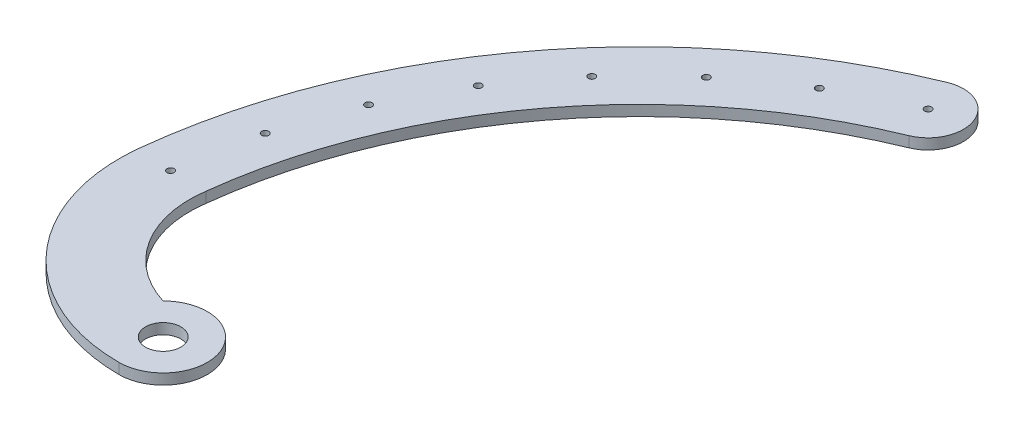
ISO-10303-21;
HEADER;
FILE_DESCRIPTION(('STEP AP214'),'2;1');
FILE_NAME('part.step','',(''),(''),'','','');
FILE_SCHEMA(('AUTOMOTIVE_DESIGN { 1 0 10303 214 1 1 1 1 }'));
ENDSEC;
DATA;
#1=APPLICATION_CONTEXT('core data for automotive mechanical design processes');
#2=APPLICATION_PROTOCOL_DEFINITION('international standard','automotive_design',2000,#1);
#3=PRODUCT_CONTEXT('',#1,'mechanical');
#4=PRODUCT('Part','Part','',(#3));
#5=PRODUCT_RELATED_PRODUCT_CATEGORY('part','',(#4));
#6=PRODUCT_DEFINITION_FORMATION('','',#4);
#7=PRODUCT_DEFINITION_CONTEXT('part definition',#1,'design');
#8=PRODUCT_DEFINITION('design','',#6,#7);
#9=PRODUCT_DEFINITION_SHAPE('','',#8);
#10=(LENGTH_UNIT() NAMED_UNIT(*) SI_UNIT(.MILLI.,.METRE.));
#11=(NAMED_UNIT(*) PLANE_ANGLE_UNIT() SI_UNIT($,.RADIAN.));
#12=(NAMED_UNIT(*) SI_UNIT($,.STERADIAN.) SOLID_ANGLE_UNIT());
#13=UNCERTAINTY_MEASURE_WITH_UNIT(LENGTH_MEASURE(1.E-05),#10,'distance_accuracy_value','');
#14=(GEOMETRIC_REPRESENTATION_CONTEXT(3) GLOBAL_UNCERTAINTY_ASSIGNED_CONTEXT((#13)) GLOBAL_UNIT_ASSIGNED_CONTEXT((#10,
#11,#12)) REPRESENTATION_CONTEXT('',''));
#15=CARTESIAN_POINT('',(0.,0.,0.));
#16=DIRECTION('',(0.,0.,1.));
#17=DIRECTION('',(1.,0.,0.));
#18=AXIS2_PLACEMENT_3D('',#15,#16,#17);
#19=CARTESIAN_POINT('',(0.,3.,-37.5));
#20=DIRECTION('',(0.,-1.,0.));
#21=DIRECTION('',(0.,0.,-1.));
#22=AXIS2_PLACEMENT_3D('',#19,#20,#21);
#23=CYLINDRICAL_SURFACE('',#22,30.0157409010684);
#24=CARTESIAN_POINT('',(0.,0.,-37.5));
#25=DIRECTION('',(0.,1.,0.));
#26=DIRECTION('',(0.,0.,1.));
#27=AXIS2_PLACEMENT_3D('',#24,#25,#26);
#28=CIRCLE('',#27,30.0157409010684);
#29=CARTESIAN_POINT('',(-29.697678368394,0.,-41.8580501795522));
#30=VERTEX_POINT('',#29);
#31=CARTESIAN_POINT('',(-8.85689524207893,0.,-8.82073730879906));
#32=VERTEX_POINT('',#31);
#33=EDGE_CURVE('E137',#30,#32,#28,.T.);
#34=ORIENTED_EDGE('',*,*,#33,.F.);
#35=DIRECTION('',(0.,-1.,0.));
#36=VECTOR('',#35,1.);
#37=CARTESIAN_POINT('',(-29.697678368394,3.,-41.8580501795522));
#38=LINE('',#37,#36);
#39=CARTESIAN_POINT('',(-29.697678368394,3.,-41.8580501795522));
#40=VERTEX_POINT('',#39);
#41=EDGE_CURVE('E11',#40,#30,#38,.T.);
#42=ORIENTED_EDGE('',*,*,#41,.F.);
#43=CARTESIAN_POINT('',(0.,3.,-37.5));
#44=DIRECTION('',(0.,1.,0.));
#45=DIRECTION('',(0.,0.,1.));
#46=AXIS2_PLACEMENT_3D('',#43,#44,#45);
#47=CIRCLE('',#46,30.0157409010684);
#48=CARTESIAN_POINT('',(-8.85689524207893,3.,-8.82073730879906));
#49=VERTEX_POINT('',#48);
#50=EDGE_CURVE('E254',#40,#49,#47,.T.);
#51=ORIENTED_EDGE('',*,*,#50,.T.);
#52=DIRECTION('',(0.,-1.,0.));
#53=VECTOR('',#52,1.);
#54=CARTESIAN_POINT('',(-8.85689524207893,3.,-8.82073730879906));
#55=LINE('',#54,#53);
#56=EDGE_CURVE('E86',#49,#32,#55,.T.);
#57=ORIENTED_EDGE('',*,*,#56,.T.);
#58=EDGE_LOOP('',(#34,#42,#51,#57));
#59=FACE_BOUND('',#58,.T.);
#60=ADVANCED_FACE('F41',(#59),#23,.F.);
#61=CARTESIAN_POINT('',(109.34518028774,3.,-25.5153620062314));
#62=DIRECTION('',(0.,-1.,0.));
#63=DIRECTION('',(0.,0.,-1.));
#64=AXIS2_PLACEMENT_3D('',#61,#62,#63);
#65=CYLINDRICAL_SURFACE('',#64,140.);
#66=CARTESIAN_POINT('',(109.34518028774,0.,-25.5153620062314));
#67=DIRECTION('',(0.,1.,0.));
#68=DIRECTION('',(0.,0.,1.));
#69=AXIS2_PLACEMENT_3D('',#66,#67,#68);
#70=CIRCLE('',#69,140.);
#71=CARTESIAN_POINT('',(56.238508843267,0.,-155.051771745304));
#72=VERTEX_POINT('',#71);
#73=EDGE_CURVE('E135',#30,#72,#70,.F.);
#74=ORIENTED_EDGE('',*,*,#73,.T.);
#75=DIRECTION('',(0.,-1.,0.));
#76=VECTOR('',#75,1.);
#77=CARTESIAN_POINT('',(56.238508843267,3.,-155.051771745304));
#78=LINE('',#77,#76);
#79=CARTESIAN_POINT('',(56.238508843267,3.,-155.051771745304));
#80=VERTEX_POINT('',#79);
#81=EDGE_CURVE('E50',#80,#72,#78,.T.);
#82=ORIENTED_EDGE('',*,*,#81,.F.);
#83=CARTESIAN_POINT('',(109.34518028774,3.,-25.5153620062314));
#84=DIRECTION('',(0.,1.,0.));
#85=DIRECTION('',(0.,0.,1.));
#86=AXIS2_PLACEMENT_3D('',#83,#84,#85);
#87=CIRCLE('',#86,140.);
#88=EDGE_CURVE('E256',#40,#80,#87,.F.);
#89=ORIENTED_EDGE('',*,*,#88,.F.);
#90=ORIENTED_EDGE('',*,*,#41,.T.);
#91=EDGE_LOOP('',(#74,#82,#89,#90));
#92=FACE_BOUND('',#91,.T.);
#93=ADVANCED_FACE('F136',(#92),#65,.F.);
#94=CARTESIAN_POINT('',(52.4451751686618,3.,-164.304372440952));
#95=DIRECTION('',(0.,-1.,0.));
#96=DIRECTION('',(0.,0.,-1.));
#97=AXIS2_PLACEMENT_3D('',#94,#95,#96);
#98=CYLINDRICAL_SURFACE('',#97,10.);
#99=CARTESIAN_POINT('',(52.4451751686618,0.,-164.304372440952));
#100=DIRECTION('',(0.,1.,0.));
#101=DIRECTION('',(0.,0.,1.));
#102=AXIS2_PLACEMENT_3D('',#99,#100,#101);
#103=CIRCLE('',#102,10.);
#104=CARTESIAN_POINT('',(48.6518414940566,0.,-173.5569731366));
#105=VERTEX_POINT('',#104);
#106=EDGE_CURVE('E132',#72,#105,#103,.T.);
#107=ORIENTED_EDGE('',*,*,#106,.T.);
#108=DIRECTION('',(0.,-1.,0.));
#109=VECTOR('',#108,1.);
#110=CARTESIAN_POINT('',(48.6518414940566,3.,-173.5569731366));
#111=LINE('',#110,#109);
#112=CARTESIAN_POINT('',(48.6518414940566,3.,-173.5569731366));
#113=VERTEX_POINT('',#112);
#114=EDGE_CURVE('E121',#113,#105,#111,.T.);
#115=ORIENTED_EDGE('',*,*,#114,.F.);
#116=CARTESIAN_POINT('',(52.4451751686618,3.,-164.304372440952));
#117=DIRECTION('',(0.,1.,0.));
#118=DIRECTION('',(0.,0.,1.));
#119=AXIS2_PLACEMENT_3D('',#116,#117,#118);
#120=CIRCLE('',#119,10.);
#121=EDGE_CURVE('E114',#80,#113,#120,.T.);
#122=ORIENTED_EDGE('',*,*,#121,.F.);
#123=ORIENTED_EDGE('',*,*,#81,.T.);
#124=EDGE_LOOP('',(#107,#115,#122,#123));
#125=FACE_BOUND('',#124,.T.);
#126=ADVANCED_FACE('F131',(#125),#98,.T.);
#127=CARTESIAN_POINT('',(109.34518028774,3.,-25.5153620062314));
#128=DIRECTION('',(0.,-1.,0.));
#129=DIRECTION('',(0.,0.,-1.));
#130=AXIS2_PLACEMENT_3D('',#127,#128,#129);
#131=CYLINDRICAL_SURFACE('',#130,160.);
#132=CARTESIAN_POINT('',(109.34518028774,0.,-25.5153620062314));
#133=DIRECTION('',(0.,1.,0.));
#134=DIRECTION('',(0.,0.,1.));
#135=AXIS2_PLACEMENT_3D('',#132,#133,#134);
#136=CIRCLE('',#135,160.);
#137=CARTESIAN_POINT('',(-49.7023546762454,0.,-42.9475627244403));
#138=VERTEX_POINT('',#137);
#139=EDGE_CURVE('E120',#105,#138,#136,.T.);
#140=ORIENTED_EDGE('',*,*,#139,.T.);
#141=DIRECTION('',(0.,-1.,0.));
#142=VECTOR('',#141,1.);
#143=CARTESIAN_POINT('',(-49.7023546762454,3.,-42.9475627244403));
#144=LINE('',#143,#142);
#145=CARTESIAN_POINT('',(-49.7023546762454,3.,-42.9475627244403));
#146=VERTEX_POINT('',#145);
#147=EDGE_CURVE('E105',#146,#138,#144,.T.);
#148=ORIENTED_EDGE('',*,*,#147,.F.);
#149=CARTESIAN_POINT('',(109.34518028774,3.,-25.5153620062314));
#150=DIRECTION('',(0.,1.,0.));
#151=DIRECTION('',(0.,0.,1.));
#152=AXIS2_PLACEMENT_3D('',#149,#150,#151);
#153=CIRCLE('',#152,160.);
#154=EDGE_CURVE('E108',#113,#146,#153,.T.);
#155=ORIENTED_EDGE('',*,*,#154,.F.);
#156=ORIENTED_EDGE('',*,*,#114,.T.);
#157=EDGE_LOOP('',(#140,#148,#155,#156));
#158=FACE_BOUND('',#157,.T.);
#159=ADVANCED_FACE('F119',(#158),#131,.T.);
#160=CARTESIAN_POINT('',(0.,3.,-37.5));
#161=DIRECTION('',(0.,-1.,0.));
#162=DIRECTION('',(0.,0.,-1.));
#163=AXIS2_PLACEMENT_3D('',#160,#161,#162);
#164=CYLINDRICAL_SURFACE('',#163,50.);
#165=CARTESIAN_POINT('',(0.,0.,-37.5));
#166=DIRECTION('',(0.,1.,0.));
#167=DIRECTION('',(0.,0.,1.));
#168=AXIS2_PLACEMENT_3D('',#165,#166,#167);
#169=CIRCLE('',#168,50.);
#170=CARTESIAN_POINT('',(0.,0.,12.5));
#171=VERTEX_POINT('',#170);
#172=EDGE_CURVE('E145',#138,#171,#169,.T.);
#173=ORIENTED_EDGE('',*,*,#172,.T.);
#174=DIRECTION('',(0.,-1.,0.));
#175=VECTOR('',#174,1.);
#176=CARTESIAN_POINT('',(0.,3.,12.5));
#177=LINE('',#176,#175);
#178=CARTESIAN_POINT('',(0.,3.,12.5));
#179=VERTEX_POINT('',#178);
#180=EDGE_CURVE('E107',#179,#171,#177,.T.);
#181=ORIENTED_EDGE('',*,*,#180,.F.);
#182=CARTESIAN_POINT('',(0.,3.,-37.5));
#183=DIRECTION('',(0.,1.,0.));
#184=DIRECTION('',(0.,0.,1.));
#185=AXIS2_PLACEMENT_3D('',#182,#183,#184);
#186=CIRCLE('',#185,50.);
#187=EDGE_CURVE('E100',#146,#179,#186,.T.);
#188=ORIENTED_EDGE('',*,*,#187,.F.);
#189=ORIENTED_EDGE('',*,*,#147,.T.);
#190=EDGE_LOOP('',(#173,#181,#188,#189));
#191=FACE_BOUND('',#190,.T.);
#192=ADVANCED_FACE('F103',(#191),#164,.T.);
#193=CARTESIAN_POINT('',(0.,3.,0.));
#194=DIRECTION('',(0.,-1.,0.));
#195=DIRECTION('',(0.,0.,-1.));
#196=AXIS2_PLACEMENT_3D('',#193,#194,#195);
#197=CYLINDRICAL_SURFACE('',#196,5.);
#198=CARTESIAN_POINT('',(0.,3.,0.));
#199=DIRECTION('',(0.,1.,0.));
#200=DIRECTION('',(0.,0.,1.));
#201=AXIS2_PLACEMENT_3D('',#198,#199,#200);
#202=CIRCLE('',#201,5.);
#203=CARTESIAN_POINT('',(0.,3.,5.));
#204=VERTEX_POINT('',#203);
#205=EDGE_CURVE('E156',#204,#204,#202,.T.);
#206=ORIENTED_EDGE('',*,*,#205,.T.);
#207=EDGE_LOOP('',(#206));
#208=FACE_BOUND('',#207,.T.);
#209=CARTESIAN_POINT('',(0.,0.,0.));
#210=DIRECTION('',(0.,1.,0.));
#211=DIRECTION('',(0.,0.,1.));
#212=AXIS2_PLACEMENT_3D('',#209,#210,#211);
#213=CIRCLE('',#212,5.);
#214=CARTESIAN_POINT('',(0.,0.,5.));
#215=VERTEX_POINT('',#214);
#216=EDGE_CURVE('E148',#215,#215,#213,.T.);
#217=ORIENTED_EDGE('',*,*,#216,.F.);
#218=EDGE_LOOP('',(#217));
#219=FACE_BOUND('',#218,.T.);
#220=ADVANCED_FACE('F199',(#208,#219),#197,.F.);
#221=CARTESIAN_POINT('',(0.,3.,0.));
#222=DIRECTION('',(0.,-1.,0.));
#223=DIRECTION('',(0.,0.,-1.));
#224=AXIS2_PLACEMENT_3D('',#221,#222,#223);
#225=CYLINDRICAL_SURFACE('',#224,12.5);
#226=CARTESIAN_POINT('',(0.,0.,0.));
#227=DIRECTION('',(0.,1.,0.));
#228=DIRECTION('',(0.,0.,1.));
#229=AXIS2_PLACEMENT_3D('',#226,#227,#228);
#230=CIRCLE('',#229,12.5);
#231=EDGE_CURVE('E79',#171,#32,#230,.T.);
#232=ORIENTED_EDGE('',*,*,#231,.T.);
#233=ORIENTED_EDGE('',*,*,#56,.F.);
#234=CARTESIAN_POINT('',(0.,3.,0.));
#235=DIRECTION('',(0.,1.,0.));
#236=DIRECTION('',(0.,0.,1.));
#237=AXIS2_PLACEMENT_3D('',#234,#235,#236);
#238=CIRCLE('',#237,12.5);
#239=EDGE_CURVE('E58',#179,#49,#238,.T.);
#240=ORIENTED_EDGE('',*,*,#239,.F.);
#241=ORIENTED_EDGE('',*,*,#180,.T.);
#242=EDGE_LOOP('',(#232,#233,#240,#241));
#243=FACE_BOUND('',#242,.T.);
#244=ADVANCED_FACE('F189',(#243),#225,.T.);
#245=CARTESIAN_POINT('',(31.9293953515161,3.,-153.994139408215));
#246=DIRECTION('',(0.,-1.,0.));
#247=DIRECTION('',(0.,0.,-1.));
#248=AXIS2_PLACEMENT_3D('',#245,#246,#247);
#249=CYLINDRICAL_SURFACE('',#248,0.999999999999992);
#250=CARTESIAN_POINT('',(31.9293953515161,3.,-153.994139408215));
#251=DIRECTION('',(0.,1.,0.));
#252=DIRECTION('',(0.,0.,1.));
#253=AXIS2_PLACEMENT_3D('',#250,#251,#252);
#254=CIRCLE('',#253,0.999999999999992);
#255=CARTESIAN_POINT('',(31.9293953515161,3.,-152.994139408215));
#256=VERTEX_POINT('',#255);
#257=EDGE_CURVE('E253',#256,#256,#254,.T.);
#258=ORIENTED_EDGE('',*,*,#257,.T.);
#259=EDGE_LOOP('',(#258));
#260=FACE_BOUND('',#259,.T.);
#261=CARTESIAN_POINT('',(31.9293953515161,0.,-153.994139408215));
#262=DIRECTION('',(0.,1.,0.));
#263=DIRECTION('',(0.,0.,1.));
#264=AXIS2_PLACEMENT_3D('',#261,#262,#263);
#265=CIRCLE('',#264,0.999999999999992);
#266=CARTESIAN_POINT('',(31.9293953515161,0.,-152.994139408215));
#267=VERTEX_POINT('',#266);
#268=EDGE_CURVE('E140',#267,#267,#265,.T.);
#269=ORIENTED_EDGE('',*,*,#268,.F.);
#270=EDGE_LOOP('',(#269));
#271=FACE_BOUND('',#270,.T.);
#272=ADVANCED_FACE('F186',(#260,#271),#249,.F.);
#273=CARTESIAN_POINT('',(13.2275469474814,3.,-140.673516563638));
#274=DIRECTION('',(0.,-1.,0.));
#275=DIRECTION('',(0.,0.,-1.));
#276=AXIS2_PLACEMENT_3D('',#273,#274,#275);
#277=CYLINDRICAL_SURFACE('',#276,1.);
#278=CARTESIAN_POINT('',(13.2275469474814,3.,-140.673516563638));
#279=DIRECTION('',(0.,1.,0.));
#280=DIRECTION('',(0.,0.,1.));
#281=AXIS2_PLACEMENT_3D('',#278,#279,#280);
#282=CIRCLE('',#281,1.);
#283=CARTESIAN_POINT('',(13.2275469474814,3.,-139.673516563638));
#284=VERTEX_POINT('',#283);
#285=EDGE_CURVE('E251',#284,#284,#282,.T.);
#286=ORIENTED_EDGE('',*,*,#285,.T.);
#287=EDGE_LOOP('',(#286));
#288=FACE_BOUND('',#287,.T.);
#289=CARTESIAN_POINT('',(13.2275469474814,0.,-140.673516563638));
#290=DIRECTION('',(0.,1.,0.));
#291=DIRECTION('',(0.,0.,1.));
#292=AXIS2_PLACEMENT_3D('',#289,#290,#291);
#293=CIRCLE('',#292,1.);
#294=CARTESIAN_POINT('',(13.2275469474814,0.,-139.673516563638));
#295=VERTEX_POINT('',#294);
#296=EDGE_CURVE('E179',#295,#295,#293,.T.);
#297=ORIENTED_EDGE('',*,*,#296,.F.);
#298=EDGE_LOOP('',(#297));
#299=FACE_BOUND('',#298,.T.);
#300=ADVANCED_FACE('F188',(#288,#299),#277,.F.);
#301=CARTESIAN_POINT('',(-3.22216651258292,3.,-124.654619792115));
#302=DIRECTION('',(0.,-1.,0.));
#303=DIRECTION('',(0.,0.,-1.));
#304=AXIS2_PLACEMENT_3D('',#301,#302,#303);
#305=CYLINDRICAL_SURFACE('',#304,0.999999999999996);
#306=CARTESIAN_POINT('',(-3.22216651258292,3.,-124.654619792115));
#307=DIRECTION('',(0.,1.,0.));
#308=DIRECTION('',(0.,0.,1.));
#309=AXIS2_PLACEMENT_3D('',#306,#307,#308);
#310=CIRCLE('',#309,0.999999999999996);
#311=CARTESIAN_POINT('',(-3.22216651258292,3.,-123.654619792115));
#312=VERTEX_POINT('',#311);
#313=EDGE_CURVE('E247',#312,#312,#310,.T.);
#314=ORIENTED_EDGE('',*,*,#313,.T.);
#315=EDGE_LOOP('',(#314));
#316=FACE_BOUND('',#315,.T.);
#317=CARTESIAN_POINT('',(-3.22216651258292,0.,-124.654619792115));
#318=DIRECTION('',(0.,1.,0.));
#319=DIRECTION('',(0.,0.,1.));
#320=AXIS2_PLACEMENT_3D('',#317,#318,#319);
#321=CIRCLE('',#320,0.999999999999996);
#322=CARTESIAN_POINT('',(-3.22216651258292,0.,-123.654619792115));
#323=VERTEX_POINT('',#322);
#324=EDGE_CURVE('E176',#323,#323,#321,.T.);
#325=ORIENTED_EDGE('',*,*,#324,.F.);
#326=EDGE_LOOP('',(#325));
#327=FACE_BOUND('',#326,.T.);
#328=ADVANCED_FACE('F196',(#316,#327),#305,.F.);
#329=CARTESIAN_POINT('',(-17.0343113344183,3.,-106.312788310074));
#330=DIRECTION('',(0.,-1.,0.));
#331=DIRECTION('',(0.,0.,-1.));
#332=AXIS2_PLACEMENT_3D('',#329,#330,#331);
#333=CYLINDRICAL_SURFACE('',#332,0.999999999999998);
#334=CARTESIAN_POINT('',(-17.0343113344183,3.,-106.312788310074));
#335=DIRECTION('',(0.,1.,0.));
#336=DIRECTION('',(0.,0.,1.));
#337=AXIS2_PLACEMENT_3D('',#334,#335,#336);
#338=CIRCLE('',#337,0.999999999999998);
#339=CARTESIAN_POINT('',(-17.0343113344183,3.,-105.312788310074));
#340=VERTEX_POINT('',#339);
#341=EDGE_CURVE('E243',#340,#340,#338,.T.);
#342=ORIENTED_EDGE('',*,*,#341,.T.);
#343=EDGE_LOOP('',(#342));
#344=FACE_BOUND('',#343,.T.);
#345=CARTESIAN_POINT('',(-17.0343113344183,0.,-106.312788310074));
#346=DIRECTION('',(0.,1.,0.));
#347=DIRECTION('',(0.,0.,1.));
#348=AXIS2_PLACEMENT_3D('',#345,#346,#347);
#349=CIRCLE('',#348,0.999999999999998);
#350=CARTESIAN_POINT('',(-17.0343113344183,0.,-105.312788310074));
#351=VERTEX_POINT('',#350);
#352=EDGE_CURVE('E173',#351,#351,#349,.T.);
#353=ORIENTED_EDGE('',*,*,#352,.F.);
#354=EDGE_LOOP('',(#353));
#355=FACE_BOUND('',#354,.T.);
#356=ADVANCED_FACE('F284',(#344,#355),#333,.F.);
#357=CARTESIAN_POINT('',(-27.8852547679932,3.,-86.0777900818481));
#358=DIRECTION('',(0.,-1.,0.));
#359=DIRECTION('',(0.,0.,-1.));
#360=AXIS2_PLACEMENT_3D('',#357,#358,#359);
#361=CYLINDRICAL_SURFACE('',#360,0.999999999999998);
#362=CARTESIAN_POINT('',(-27.8852547679932,3.,-86.0777900818481));
#363=DIRECTION('',(0.,1.,0.));
#364=DIRECTION('',(0.,0.,1.));
#365=AXIS2_PLACEMENT_3D('',#362,#363,#364);
#366=CIRCLE('',#365,0.999999999999998);
#367=CARTESIAN_POINT('',(-27.8852547679932,3.,-85.0777900818481));
#368=VERTEX_POINT('',#367);
#369=EDGE_CURVE('E239',#368,#368,#366,.T.);
#370=ORIENTED_EDGE('',*,*,#369,.T.);
#371=EDGE_LOOP('',(#370));
#372=FACE_BOUND('',#371,.T.);
#373=CARTESIAN_POINT('',(-27.8852547679932,0.,-86.0777900818481));
#374=DIRECTION('',(0.,1.,0.));
#375=DIRECTION('',(0.,0.,1.));
#376=AXIS2_PLACEMENT_3D('',#373,#374,#375);
#377=CIRCLE('',#376,0.999999999999998);
#378=CARTESIAN_POINT('',(-27.8852547679932,0.,-85.0777900818481));
#379=VERTEX_POINT('',#378);
#380=EDGE_CURVE('E170',#379,#379,#377,.T.);
#381=ORIENTED_EDGE('',*,*,#380,.F.);
#382=EDGE_LOOP('',(#381));
#383=FACE_BOUND('',#382,.T.);
#384=ADVANCED_FACE('F290',(#372,#383),#361,.F.);
#385=CARTESIAN_POINT('',(-35.520748055483,3.,-64.4237519145307));
#386=DIRECTION('',(0.,-1.,0.));
#387=DIRECTION('',(0.,0.,-1.));
#388=AXIS2_PLACEMENT_3D('',#385,#386,#387);
#389=CYLINDRICAL_SURFACE('',#388,0.999999999999974);
#390=CARTESIAN_POINT('',(-35.520748055483,3.,-64.4237519145307));
#391=DIRECTION('',(0.,1.,0.));
#392=DIRECTION('',(0.,0.,1.));
#393=AXIS2_PLACEMENT_3D('',#390,#391,#392);
#394=CIRCLE('',#393,0.999999999999974);
#395=CARTESIAN_POINT('',(-35.520748055483,3.,-63.4237519145307));
#396=VERTEX_POINT('',#395);
#397=EDGE_CURVE('E235',#396,#396,#394,.T.);
#398=ORIENTED_EDGE('',*,*,#397,.T.);
#399=EDGE_LOOP('',(#398));
#400=FACE_BOUND('',#399,.T.);
#401=CARTESIAN_POINT('',(-35.520748055483,0.,-64.4237519145307));
#402=DIRECTION('',(0.,1.,0.));
#403=DIRECTION('',(0.,0.,1.));
#404=AXIS2_PLACEMENT_3D('',#401,#402,#403);
#405=CIRCLE('',#404,0.999999999999974);
#406=CARTESIAN_POINT('',(-35.520748055483,0.,-63.4237519145307));
#407=VERTEX_POINT('',#406);
#408=EDGE_CURVE('E167',#407,#407,#405,.T.);
#409=ORIENTED_EDGE('',*,*,#408,.F.);
#410=EDGE_LOOP('',(#409));
#411=FACE_BOUND('',#410,.T.);
#412=ADVANCED_FACE('F269',(#400,#411),#389,.F.);
#413=CARTESIAN_POINT('',(-39.7618837409963,3.,-41.8580501795523));
#414=DIRECTION('',(0.,-1.,0.));
#415=DIRECTION('',(0.,0.,-1.));
#416=AXIS2_PLACEMENT_3D('',#413,#414,#415);
#417=CYLINDRICAL_SURFACE('',#416,1.00000000000004);
#418=CARTESIAN_POINT('',(-39.7618837409963,3.,-41.8580501795523));
#419=DIRECTION('',(0.,1.,0.));
#420=DIRECTION('',(0.,0.,1.));
#421=AXIS2_PLACEMENT_3D('',#418,#419,#420);
#422=CIRCLE('',#421,1.00000000000004);
#423=CARTESIAN_POINT('',(-39.7618837409963,3.,-40.8580501795522));
#424=VERTEX_POINT('',#423);
#425=EDGE_CURVE('E153',#424,#424,#422,.T.);
#426=ORIENTED_EDGE('',*,*,#425,.T.);
#427=EDGE_LOOP('',(#426));
#428=FACE_BOUND('',#427,.T.);
#429=CARTESIAN_POINT('',(-39.7618837409963,0.,-41.8580501795523));
#430=DIRECTION('',(0.,1.,0.));
#431=DIRECTION('',(0.,0.,1.));
#432=AXIS2_PLACEMENT_3D('',#429,#430,#431);
#433=CIRCLE('',#432,1.00000000000004);
#434=CARTESIAN_POINT('',(-39.7618837409963,0.,-40.8580501795522));
#435=VERTEX_POINT('',#434);
#436=EDGE_CURVE('E164',#435,#435,#433,.T.);
#437=ORIENTED_EDGE('',*,*,#436,.F.);
#438=EDGE_LOOP('',(#437));
#439=FACE_BOUND('',#438,.T.);
#440=ADVANCED_FACE('F43',(#428,#439),#417,.F.);
#441=CARTESIAN_POINT('',(52.4451751686618,3.,-164.304372440952));
#442=DIRECTION('',(0.,-1.,0.));
#443=DIRECTION('',(0.,0.,-1.));
#444=AXIS2_PLACEMENT_3D('',#441,#442,#443);
#445=CYLINDRICAL_SURFACE('',#444,0.999999999999998);
#446=CARTESIAN_POINT('',(52.4451751686618,3.,-164.304372440952));
#447=DIRECTION('',(0.,1.,0.));
#448=DIRECTION('',(0.,0.,1.));
#449=AXIS2_PLACEMENT_3D('',#446,#447,#448);
#450=CIRCLE('',#449,0.999999999999998);
#451=CARTESIAN_POINT('',(52.4451751686618,3.,-163.304372440952));
#452=VERTEX_POINT('',#451);
#453=EDGE_CURVE('E154',#452,#452,#450,.T.);
#454=ORIENTED_EDGE('',*,*,#453,.T.);
#455=EDGE_LOOP('',(#454));
#456=FACE_BOUND('',#455,.T.);
#457=CARTESIAN_POINT('',(52.4451751686618,0.,-164.304372440952));
#458=DIRECTION('',(0.,1.,0.));
#459=DIRECTION('',(0.,0.,1.));
#460=AXIS2_PLACEMENT_3D('',#457,#458,#459);
#461=CIRCLE('',#460,0.999999999999998);
#462=CARTESIAN_POINT('',(52.4451751686618,0.,-163.304372440952));
#463=VERTEX_POINT('',#462);
#464=EDGE_CURVE('E151',#463,#463,#461,.T.);
#465=ORIENTED_EDGE('',*,*,#464,.F.);
#466=EDGE_LOOP('',(#465));
#467=FACE_BOUND('',#466,.T.);
#468=ADVANCED_FACE('F219',(#456,#467),#445,.F.);
#469=CARTESIAN_POINT('',(0.,3.,0.));
#470=DIRECTION('',(0.,1.,0.));
#471=DIRECTION('',(0.,0.,1.));
#472=AXIS2_PLACEMENT_3D('',#469,#470,#471);
#473=PLANE('',#472);
#474=ORIENTED_EDGE('',*,*,#425,.F.);
#475=EDGE_LOOP('',(#474));
#476=FACE_BOUND('',#475,.T.);
#477=ORIENTED_EDGE('',*,*,#397,.F.);
#478=EDGE_LOOP('',(#477));
#479=FACE_BOUND('',#478,.T.);
#480=ORIENTED_EDGE('',*,*,#369,.F.);
#481=EDGE_LOOP('',(#480));
#482=FACE_BOUND('',#481,.T.);
#483=ORIENTED_EDGE('',*,*,#341,.F.);
#484=EDGE_LOOP('',(#483));
#485=FACE_BOUND('',#484,.T.);
#486=ORIENTED_EDGE('',*,*,#313,.F.);
#487=EDGE_LOOP('',(#486));
#488=FACE_BOUND('',#487,.T.);
#489=ORIENTED_EDGE('',*,*,#285,.F.);
#490=EDGE_LOOP('',(#489));
#491=FACE_BOUND('',#490,.T.);
#492=ORIENTED_EDGE('',*,*,#257,.F.);
#493=EDGE_LOOP('',(#492));
#494=FACE_BOUND('',#493,.T.);
#495=ORIENTED_EDGE('',*,*,#50,.F.);
#496=ORIENTED_EDGE('',*,*,#88,.T.);
#497=ORIENTED_EDGE('',*,*,#121,.T.);
#498=ORIENTED_EDGE('',*,*,#154,.T.);
#499=ORIENTED_EDGE('',*,*,#187,.T.);
#500=ORIENTED_EDGE('',*,*,#239,.T.);
#501=EDGE_LOOP('',(#495,#496,#497,#498,#499,#500));
#502=FACE_BOUND('',#501,.T.);
#503=ORIENTED_EDGE('',*,*,#205,.F.);
#504=EDGE_LOOP('',(#503));
#505=FACE_BOUND('',#504,.T.);
#506=ORIENTED_EDGE('',*,*,#453,.F.);
#507=EDGE_LOOP('',(#506));
#508=FACE_BOUND('',#507,.T.);
#509=ADVANCED_FACE('F111',(#476,#479,#482,#485,#488,#491,#494,#502,#505,#508),#473,.T.);
#510=CARTESIAN_POINT('',(0.,0.,0.));
#511=DIRECTION('',(0.,1.,0.));
#512=DIRECTION('',(0.,0.,1.));
#513=AXIS2_PLACEMENT_3D('',#510,#511,#512);
#514=PLANE('',#513);
#515=ORIENTED_EDGE('',*,*,#436,.T.);
#516=EDGE_LOOP('',(#515));
#517=FACE_BOUND('',#516,.T.);
#518=ORIENTED_EDGE('',*,*,#408,.T.);
#519=EDGE_LOOP('',(#518));
#520=FACE_BOUND('',#519,.T.);
#521=ORIENTED_EDGE('',*,*,#380,.T.);
#522=EDGE_LOOP('',(#521));
#523=FACE_BOUND('',#522,.T.);
#524=ORIENTED_EDGE('',*,*,#352,.T.);
#525=EDGE_LOOP('',(#524));
#526=FACE_BOUND('',#525,.T.);
#527=ORIENTED_EDGE('',*,*,#324,.T.);
#528=EDGE_LOOP('',(#527));
#529=FACE_BOUND('',#528,.T.);
#530=ORIENTED_EDGE('',*,*,#296,.T.);
#531=EDGE_LOOP('',(#530));
#532=FACE_BOUND('',#531,.T.);
#533=ORIENTED_EDGE('',*,*,#268,.T.);
#534=EDGE_LOOP('',(#533));
#535=FACE_BOUND('',#534,.T.);
#536=ORIENTED_EDGE('',*,*,#33,.T.);
#537=ORIENTED_EDGE('',*,*,#231,.F.);
#538=ORIENTED_EDGE('',*,*,#172,.F.);
#539=ORIENTED_EDGE('',*,*,#139,.F.);
#540=ORIENTED_EDGE('',*,*,#106,.F.);
#541=ORIENTED_EDGE('',*,*,#73,.F.);
#542=EDGE_LOOP('',(#536,#537,#538,#539,#540,#541));
#543=FACE_BOUND('',#542,.T.);
#544=ORIENTED_EDGE('',*,*,#216,.T.);
#545=EDGE_LOOP('',(#544));
#546=FACE_BOUND('',#545,.T.);
#547=ORIENTED_EDGE('',*,*,#464,.T.);
#548=EDGE_LOOP('',(#547));
#549=FACE_BOUND('',#548,.T.);
#550=ADVANCED_FACE('F184',(#517,#520,#523,#526,#529,#532,#535,#543,#546,#549),#514,.F.);
#551=CLOSED_SHELL('',(#60,#93,#126,#159,#192,#220,#244,#272,#300,#328,#356,#384,#412,#440,#468,
#509,#550));
#552=MANIFOLD_SOLID_BREP('B2',#551);
#553=ADVANCED_BREP_SHAPE_REPRESENTATION('',(#18,#552),#14);
#554=SHAPE_DEFINITION_REPRESENTATION(#9,#553);
ENDSEC;
END-ISO-10303-21;
